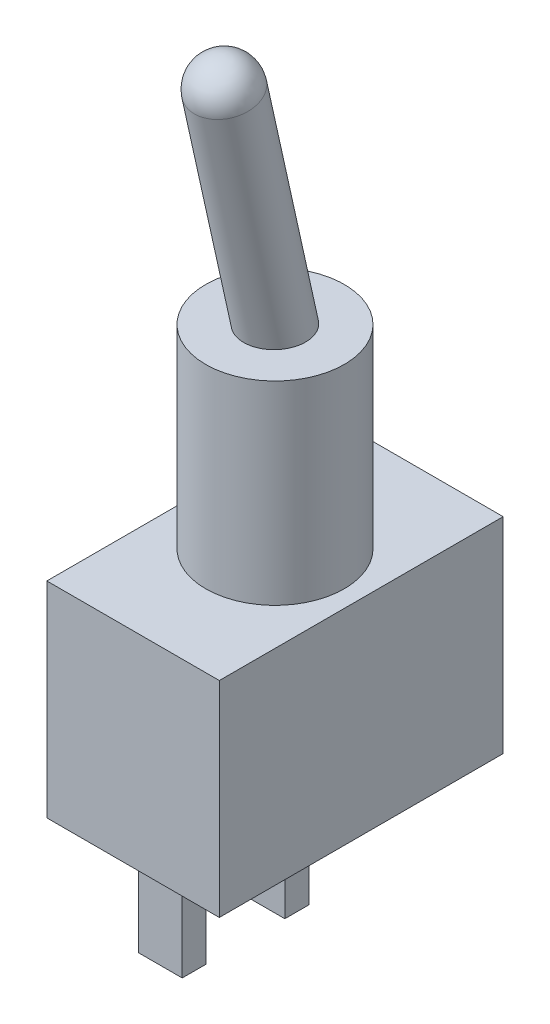
ISO-10303-21;
HEADER;
FILE_DESCRIPTION(('STEP AP214'),'2;1');
FILE_NAME('part.step','',(''),(''),'','','');
FILE_SCHEMA(('AUTOMOTIVE_DESIGN { 1 0 10303 214 1 1 1 1 }'));
ENDSEC;
DATA;
#1=APPLICATION_CONTEXT('core data for automotive mechanical design processes');
#2=APPLICATION_PROTOCOL_DEFINITION('international standard','automotive_design',2000,#1);
#3=PRODUCT_CONTEXT('',#1,'mechanical');
#4=PRODUCT('Part','Part','',(#3));
#5=PRODUCT_RELATED_PRODUCT_CATEGORY('part','',(#4));
#6=PRODUCT_DEFINITION_FORMATION('','',#4);
#7=PRODUCT_DEFINITION_CONTEXT('part definition',#1,'design');
#8=PRODUCT_DEFINITION('design','',#6,#7);
#9=PRODUCT_DEFINITION_SHAPE('','',#8);
#10=(LENGTH_UNIT() NAMED_UNIT(*) SI_UNIT(.MILLI.,.METRE.));
#11=(NAMED_UNIT(*) PLANE_ANGLE_UNIT() SI_UNIT($,.RADIAN.));
#12=(NAMED_UNIT(*) SI_UNIT($,.STERADIAN.) SOLID_ANGLE_UNIT());
#13=UNCERTAINTY_MEASURE_WITH_UNIT(LENGTH_MEASURE(1.E-05),#10,'distance_accuracy_value','');
#14=(GEOMETRIC_REPRESENTATION_CONTEXT(3) GLOBAL_UNCERTAINTY_ASSIGNED_CONTEXT((#13)) GLOBAL_UNIT_ASSIGNED_CONTEXT((#10,
#11,#12)) REPRESENTATION_CONTEXT('',''));
#15=CARTESIAN_POINT('',(0.,0.,0.));
#16=DIRECTION('',(0.,0.,1.));
#17=DIRECTION('',(1.,0.,0.));
#18=AXIS2_PLACEMENT_3D('',#15,#16,#17);
#19=CARTESIAN_POINT('',(0.,-9.4,0.));
#20=DIRECTION('',(0.,1.,0.));
#21=DIRECTION('',(0.,0.,1.));
#22=AXIS2_PLACEMENT_3D('',#19,#20,#21);
#23=PLANE('',#22);
#24=DIRECTION('',(0.,0.,1.));
#25=VECTOR('',#24,1.);
#26=CARTESIAN_POINT('',(0.999999999999999,-9.4,5.25));
#27=LINE('',#26,#25);
#28=CARTESIAN_POINT('',(0.999999999999999,-9.4,4.15));
#29=VERTEX_POINT('',#28);
#30=CARTESIAN_POINT('',(0.999999999999999,-9.4,5.25));
#31=VERTEX_POINT('',#30);
#32=EDGE_CURVE('E138',#29,#31,#27,.T.);
#33=ORIENTED_EDGE('',*,*,#32,.F.);
#34=DIRECTION('',(1.,0.,0.));
#35=VECTOR('',#34,1.);
#36=CARTESIAN_POINT('',(-1.,-9.4,4.15));
#37=LINE('',#36,#35);
#38=CARTESIAN_POINT('',(-1.,-9.4,4.15));
#39=VERTEX_POINT('',#38);
#40=EDGE_CURVE('E171',#39,#29,#37,.T.);
#41=ORIENTED_EDGE('',*,*,#40,.F.);
#42=DIRECTION('',(0.,0.,-1.));
#43=VECTOR('',#42,1.);
#44=CARTESIAN_POINT('',(-1.,-9.4,5.25));
#45=LINE('',#44,#43);
#46=CARTESIAN_POINT('',(-1.,-9.4,5.25));
#47=VERTEX_POINT('',#46);
#48=EDGE_CURVE('E183',#47,#39,#45,.T.);
#49=ORIENTED_EDGE('',*,*,#48,.F.);
#50=DIRECTION('',(-1.,0.,0.));
#51=VECTOR('',#50,1.);
#52=CARTESIAN_POINT('',(-1.,-9.4,5.25));
#53=LINE('',#52,#51);
#54=EDGE_CURVE('E180',#31,#47,#53,.T.);
#55=ORIENTED_EDGE('',*,*,#54,.F.);
#56=EDGE_LOOP('',(#33,#41,#49,#55));
#57=FACE_BOUND('',#56,.T.);
#58=DIRECTION('',(0.,0.,-1.));
#59=VECTOR('',#58,1.);
#60=CARTESIAN_POINT('',(3.95,-9.4,-6.5));
#61=LINE('',#60,#59);
#62=CARTESIAN_POINT('',(3.95,-9.4,6.5));
#63=VERTEX_POINT('',#62);
#64=CARTESIAN_POINT('',(3.95,-9.4,-6.5));
#65=VERTEX_POINT('',#64);
#66=EDGE_CURVE('E200',#63,#65,#61,.T.);
#67=ORIENTED_EDGE('',*,*,#66,.F.);
#68=DIRECTION('',(1.,0.,0.));
#69=VECTOR('',#68,1.);
#70=CARTESIAN_POINT('',(-3.95,-9.4,6.5));
#71=LINE('',#70,#69);
#72=CARTESIAN_POINT('',(-3.95,-9.4,6.5));
#73=VERTEX_POINT('',#72);
#74=EDGE_CURVE('E210',#73,#63,#71,.T.);
#75=ORIENTED_EDGE('',*,*,#74,.F.);
#76=DIRECTION('',(0.,0.,1.));
#77=VECTOR('',#76,1.);
#78=CARTESIAN_POINT('',(-3.95,-9.4,-6.5));
#79=LINE('',#78,#77);
#80=CARTESIAN_POINT('',(-3.95,-9.4,-6.5));
#81=VERTEX_POINT('',#80);
#82=EDGE_CURVE('E207',#81,#73,#79,.T.);
#83=ORIENTED_EDGE('',*,*,#82,.F.);
#84=DIRECTION('',(-1.,0.,0.));
#85=VECTOR('',#84,1.);
#86=CARTESIAN_POINT('',(-3.95,-9.4,-6.5));
#87=LINE('',#86,#85);
#88=EDGE_CURVE('E203',#65,#81,#87,.T.);
#89=ORIENTED_EDGE('',*,*,#88,.F.);
#90=EDGE_LOOP('',(#67,#75,#83,#89));
#91=FACE_BOUND('',#90,.T.);
#92=DIRECTION('',(0.,0.,1.));
#93=VECTOR('',#92,1.);
#94=CARTESIAN_POINT('',(1.,-9.4,-0.55));
#95=LINE('',#94,#93);
#96=CARTESIAN_POINT('',(1.,-9.4,-0.55));
#97=VERTEX_POINT('',#96);
#98=CARTESIAN_POINT('',(1.,-9.4,0.55));
#99=VERTEX_POINT('',#98);
#100=EDGE_CURVE('E132',#97,#99,#95,.T.);
#101=ORIENTED_EDGE('',*,*,#100,.F.);
#102=DIRECTION('',(1.,0.,0.));
#103=VECTOR('',#102,1.);
#104=CARTESIAN_POINT('',(-1.,-9.4,-0.55));
#105=LINE('',#104,#103);
#106=CARTESIAN_POINT('',(-1.,-9.4,-0.55));
#107=VERTEX_POINT('',#106);
#108=EDGE_CURVE('E134',#107,#97,#105,.T.);
#109=ORIENTED_EDGE('',*,*,#108,.F.);
#110=DIRECTION('',(0.,0.,-1.));
#111=VECTOR('',#110,1.);
#112=CARTESIAN_POINT('',(-1.,-9.4,-0.55));
#113=LINE('',#112,#111);
#114=CARTESIAN_POINT('',(-1.,-9.4,0.55));
#115=VERTEX_POINT('',#114);
#116=EDGE_CURVE('E67',#115,#107,#113,.T.);
#117=ORIENTED_EDGE('',*,*,#116,.F.);
#118=DIRECTION('',(-1.,0.,0.));
#119=VECTOR('',#118,1.);
#120=CARTESIAN_POINT('',(-1.,-9.4,0.55));
#121=LINE('',#120,#119);
#122=EDGE_CURVE('E62',#99,#115,#121,.T.);
#123=ORIENTED_EDGE('',*,*,#122,.F.);
#124=EDGE_LOOP('',(#101,#109,#117,#123));
#125=FACE_BOUND('',#124,.T.);
#126=ADVANCED_FACE('F45',(#57,#91,#125),#23,.F.);
#127=CARTESIAN_POINT('',(3.95,-9.4,-6.5));
#128=DIRECTION('',(1.,0.,0.));
#129=DIRECTION('',(0.,0.,-1.));
#130=AXIS2_PLACEMENT_3D('',#127,#128,#129);
#131=PLANE('',#130);
#132=DIRECTION('',(0.,0.,-1.));
#133=VECTOR('',#132,1.);
#134=CARTESIAN_POINT('',(3.95,0.,-6.5));
#135=LINE('',#134,#133);
#136=CARTESIAN_POINT('',(3.95,0.,6.5));
#137=VERTEX_POINT('',#136);
#138=CARTESIAN_POINT('',(3.95,0.,-6.5));
#139=VERTEX_POINT('',#138);
#140=EDGE_CURVE('E199',#137,#139,#135,.T.);
#141=ORIENTED_EDGE('',*,*,#140,.F.);
#142=DIRECTION('',(0.,1.,0.));
#143=VECTOR('',#142,1.);
#144=CARTESIAN_POINT('',(3.95,-9.4,6.5));
#145=LINE('',#144,#143);
#146=EDGE_CURVE('E54',#63,#137,#145,.T.);
#147=ORIENTED_EDGE('',*,*,#146,.F.);
#148=ORIENTED_EDGE('',*,*,#66,.T.);
#149=DIRECTION('',(0.,1.,0.));
#150=VECTOR('',#149,1.);
#151=CARTESIAN_POINT('',(3.95,-9.4,-6.5));
#152=LINE('',#151,#150);
#153=EDGE_CURVE('E213',#65,#139,#152,.T.);
#154=ORIENTED_EDGE('',*,*,#153,.T.);
#155=EDGE_LOOP('',(#141,#147,#148,#154));
#156=FACE_BOUND('',#155,.T.);
#157=ADVANCED_FACE('F47',(#156),#131,.T.);
#158=CARTESIAN_POINT('',(-3.95,-9.4,6.5));
#159=DIRECTION('',(0.,0.,1.));
#160=DIRECTION('',(1.,0.,0.));
#161=AXIS2_PLACEMENT_3D('',#158,#159,#160);
#162=PLANE('',#161);
#163=DIRECTION('',(1.,0.,0.));
#164=VECTOR('',#163,1.);
#165=CARTESIAN_POINT('',(-3.95,0.,6.5));
#166=LINE('',#165,#164);
#167=CARTESIAN_POINT('',(-3.95,0.,6.5));
#168=VERTEX_POINT('',#167);
#169=EDGE_CURVE('E204',#168,#137,#166,.T.);
#170=ORIENTED_EDGE('',*,*,#169,.F.);
#171=DIRECTION('',(0.,1.,0.));
#172=VECTOR('',#171,1.);
#173=CARTESIAN_POINT('',(-3.95,-9.4,6.5));
#174=LINE('',#173,#172);
#175=EDGE_CURVE('E225',#73,#168,#174,.T.);
#176=ORIENTED_EDGE('',*,*,#175,.F.);
#177=ORIENTED_EDGE('',*,*,#74,.T.);
#178=ORIENTED_EDGE('',*,*,#146,.T.);
#179=EDGE_LOOP('',(#170,#176,#177,#178));
#180=FACE_BOUND('',#179,.T.);
#181=ADVANCED_FACE('F240',(#180),#162,.T.);
#182=CARTESIAN_POINT('',(-3.95,-9.4,-6.5));
#183=DIRECTION('',(-1.,0.,0.));
#184=DIRECTION('',(0.,0.,1.));
#185=AXIS2_PLACEMENT_3D('',#182,#183,#184);
#186=PLANE('',#185);
#187=DIRECTION('',(0.,0.,1.));
#188=VECTOR('',#187,1.);
#189=CARTESIAN_POINT('',(-3.95,0.,-6.5));
#190=LINE('',#189,#188);
#191=CARTESIAN_POINT('',(-3.95,0.,-6.5));
#192=VERTEX_POINT('',#191);
#193=EDGE_CURVE('E219',#192,#168,#190,.T.);
#194=ORIENTED_EDGE('',*,*,#193,.F.);
#195=DIRECTION('',(0.,1.,0.));
#196=VECTOR('',#195,1.);
#197=CARTESIAN_POINT('',(-3.95,-9.4,-6.5));
#198=LINE('',#197,#196);
#199=EDGE_CURVE('E227',#81,#192,#198,.T.);
#200=ORIENTED_EDGE('',*,*,#199,.F.);
#201=ORIENTED_EDGE('',*,*,#82,.T.);
#202=ORIENTED_EDGE('',*,*,#175,.T.);
#203=EDGE_LOOP('',(#194,#200,#201,#202));
#204=FACE_BOUND('',#203,.T.);
#205=ADVANCED_FACE('F245',(#204),#186,.T.);
#206=CARTESIAN_POINT('',(-3.95,-9.4,-6.5));
#207=DIRECTION('',(0.,0.,-1.));
#208=DIRECTION('',(-1.,0.,0.));
#209=AXIS2_PLACEMENT_3D('',#206,#207,#208);
#210=PLANE('',#209);
#211=DIRECTION('',(-1.,0.,0.));
#212=VECTOR('',#211,1.);
#213=CARTESIAN_POINT('',(-3.95,0.,-6.5));
#214=LINE('',#213,#212);
#215=EDGE_CURVE('E216',#139,#192,#214,.T.);
#216=ORIENTED_EDGE('',*,*,#215,.F.);
#217=ORIENTED_EDGE('',*,*,#153,.F.);
#218=ORIENTED_EDGE('',*,*,#88,.T.);
#219=ORIENTED_EDGE('',*,*,#199,.T.);
#220=EDGE_LOOP('',(#216,#217,#218,#219));
#221=FACE_BOUND('',#220,.T.);
#222=ADVANCED_FACE('F234',(#221),#210,.T.);
#223=CARTESIAN_POINT('',(0.,0.,0.));
#224=DIRECTION('',(0.,1.,0.));
#225=DIRECTION('',(0.,0.,1.));
#226=AXIS2_PLACEMENT_3D('',#223,#224,#225);
#227=PLANE('',#226);
#228=CARTESIAN_POINT('',(0.,0.,0.));
#229=DIRECTION('',(0.,1.,0.));
#230=DIRECTION('',(0.,0.,1.));
#231=AXIS2_PLACEMENT_3D('',#228,#229,#230);
#232=CIRCLE('',#231,3.175);
#233=CARTESIAN_POINT('',(0.,0.,3.175));
#234=VERTEX_POINT('',#233);
#235=EDGE_CURVE('E11',#234,#234,#232,.T.);
#236=ORIENTED_EDGE('',*,*,#235,.F.);
#237=EDGE_LOOP('',(#236));
#238=FACE_BOUND('',#237,.T.);
#239=ORIENTED_EDGE('',*,*,#140,.T.);
#240=ORIENTED_EDGE('',*,*,#215,.T.);
#241=ORIENTED_EDGE('',*,*,#193,.T.);
#242=ORIENTED_EDGE('',*,*,#169,.T.);
#243=EDGE_LOOP('',(#239,#240,#241,#242));
#244=FACE_BOUND('',#243,.T.);
#245=ADVANCED_FACE('F237',(#238,#244),#227,.T.);
#246=CARTESIAN_POINT('',(0.999999999999999,-13.9,5.25));
#247=DIRECTION('',(-1.,0.,0.));
#248=DIRECTION('',(0.,0.,1.));
#249=AXIS2_PLACEMENT_3D('',#246,#247,#248);
#250=PLANE('',#249);
#251=ORIENTED_EDGE('',*,*,#32,.T.);
#252=DIRECTION('',(0.,1.,0.));
#253=VECTOR('',#252,1.);
#254=CARTESIAN_POINT('',(0.999999999999999,-13.9,5.25));
#255=LINE('',#254,#253);
#256=CARTESIAN_POINT('',(0.999999999999999,-13.9,5.25));
#257=VERTEX_POINT('',#256);
#258=EDGE_CURVE('E196',#257,#31,#255,.T.);
#259=ORIENTED_EDGE('',*,*,#258,.F.);
#260=DIRECTION('',(0.,0.,1.));
#261=VECTOR('',#260,1.);
#262=CARTESIAN_POINT('',(0.999999999999999,-13.9,5.25));
#263=LINE('',#262,#261);
#264=CARTESIAN_POINT('',(0.999999999999999,-13.9,4.15));
#265=VERTEX_POINT('',#264);
#266=EDGE_CURVE('E167',#265,#257,#263,.T.);
#267=ORIENTED_EDGE('',*,*,#266,.F.);
#268=DIRECTION('',(0.,1.,0.));
#269=VECTOR('',#268,1.);
#270=CARTESIAN_POINT('',(0.999999999999999,-13.9,4.15));
#271=LINE('',#270,#269);
#272=EDGE_CURVE('E177',#265,#29,#271,.T.);
#273=ORIENTED_EDGE('',*,*,#272,.T.);
#274=EDGE_LOOP('',(#251,#259,#267,#273));
#275=FACE_BOUND('',#274,.T.);
#276=ADVANCED_FACE('F261',(#275),#250,.F.);
#277=CARTESIAN_POINT('',(-1.,-13.9,5.25));
#278=DIRECTION('',(0.,0.,-1.));
#279=DIRECTION('',(-1.,0.,0.));
#280=AXIS2_PLACEMENT_3D('',#277,#278,#279);
#281=PLANE('',#280);
#282=ORIENTED_EDGE('',*,*,#54,.T.);
#283=DIRECTION('',(0.,1.,0.));
#284=VECTOR('',#283,1.);
#285=CARTESIAN_POINT('',(-1.,-13.9,5.25));
#286=LINE('',#285,#284);
#287=CARTESIAN_POINT('',(-1.,-13.9,5.25));
#288=VERTEX_POINT('',#287);
#289=EDGE_CURVE('E193',#288,#47,#286,.T.);
#290=ORIENTED_EDGE('',*,*,#289,.F.);
#291=DIRECTION('',(-1.,0.,0.));
#292=VECTOR('',#291,1.);
#293=CARTESIAN_POINT('',(-1.,-13.9,5.25));
#294=LINE('',#293,#292);
#295=EDGE_CURVE('E170',#257,#288,#294,.T.);
#296=ORIENTED_EDGE('',*,*,#295,.F.);
#297=ORIENTED_EDGE('',*,*,#258,.T.);
#298=EDGE_LOOP('',(#282,#290,#296,#297));
#299=FACE_BOUND('',#298,.T.);
#300=ADVANCED_FACE('F268',(#299),#281,.F.);
#301=CARTESIAN_POINT('',(-1.,-13.9,5.25));
#302=DIRECTION('',(1.,0.,0.));
#303=DIRECTION('',(0.,0.,-1.));
#304=AXIS2_PLACEMENT_3D('',#301,#302,#303);
#305=PLANE('',#304);
#306=ORIENTED_EDGE('',*,*,#48,.T.);
#307=DIRECTION('',(0.,1.,0.));
#308=VECTOR('',#307,1.);
#309=CARTESIAN_POINT('',(-1.,-13.9,4.15));
#310=LINE('',#309,#308);
#311=CARTESIAN_POINT('',(-1.,-13.9,4.15));
#312=VERTEX_POINT('',#311);
#313=EDGE_CURVE('E190',#312,#39,#310,.T.);
#314=ORIENTED_EDGE('',*,*,#313,.F.);
#315=DIRECTION('',(0.,0.,-1.));
#316=VECTOR('',#315,1.);
#317=CARTESIAN_POINT('',(-1.,-13.9,5.25));
#318=LINE('',#317,#316);
#319=EDGE_CURVE('E173',#288,#312,#318,.T.);
#320=ORIENTED_EDGE('',*,*,#319,.F.);
#321=ORIENTED_EDGE('',*,*,#289,.T.);
#322=EDGE_LOOP('',(#306,#314,#320,#321));
#323=FACE_BOUND('',#322,.T.);
#324=ADVANCED_FACE('F309',(#323),#305,.F.);
#325=CARTESIAN_POINT('',(-1.,-13.9,4.15));
#326=DIRECTION('',(0.,0.,1.));
#327=DIRECTION('',(1.,0.,0.));
#328=AXIS2_PLACEMENT_3D('',#325,#326,#327);
#329=PLANE('',#328);
#330=ORIENTED_EDGE('',*,*,#40,.T.);
#331=ORIENTED_EDGE('',*,*,#272,.F.);
#332=DIRECTION('',(1.,0.,0.));
#333=VECTOR('',#332,1.);
#334=CARTESIAN_POINT('',(-1.,-13.9,4.15));
#335=LINE('',#334,#333);
#336=EDGE_CURVE('E175',#312,#265,#335,.T.);
#337=ORIENTED_EDGE('',*,*,#336,.F.);
#338=ORIENTED_EDGE('',*,*,#313,.T.);
#339=EDGE_LOOP('',(#330,#331,#337,#338));
#340=FACE_BOUND('',#339,.T.);
#341=ADVANCED_FACE('F305',(#340),#329,.F.);
#342=CARTESIAN_POINT('',(0.,-13.9,0.));
#343=DIRECTION('',(0.,-1.,0.));
#344=DIRECTION('',(0.,0.,-1.));
#345=AXIS2_PLACEMENT_3D('',#342,#343,#344);
#346=PLANE('',#345);
#347=ORIENTED_EDGE('',*,*,#266,.T.);
#348=ORIENTED_EDGE('',*,*,#295,.T.);
#349=ORIENTED_EDGE('',*,*,#319,.T.);
#350=ORIENTED_EDGE('',*,*,#336,.T.);
#351=EDGE_LOOP('',(#347,#348,#349,#350));
#352=FACE_BOUND('',#351,.T.);
#353=ADVANCED_FACE('F293',(#352),#346,.T.);
#354=CARTESIAN_POINT('',(1.,-13.9,-0.55));
#355=DIRECTION('',(-1.,0.,0.));
#356=DIRECTION('',(0.,0.,1.));
#357=AXIS2_PLACEMENT_3D('',#354,#355,#356);
#358=PLANE('',#357);
#359=ORIENTED_EDGE('',*,*,#100,.T.);
#360=DIRECTION('',(0.,1.,0.));
#361=VECTOR('',#360,1.);
#362=CARTESIAN_POINT('',(1.,-13.9,0.55));
#363=LINE('',#362,#361);
#364=CARTESIAN_POINT('',(1.,-13.9,0.55));
#365=VERTEX_POINT('',#364);
#366=EDGE_CURVE('E531',#365,#99,#363,.T.);
#367=ORIENTED_EDGE('',*,*,#366,.F.);
#368=DIRECTION('',(0.,0.,1.));
#369=VECTOR('',#368,1.);
#370=CARTESIAN_POINT('',(1.,-13.9,-0.55));
#371=LINE('',#370,#369);
#372=CARTESIAN_POINT('',(1.,-13.9,-0.55));
#373=VERTEX_POINT('',#372);
#374=EDGE_CURVE('E149',#373,#365,#371,.T.);
#375=ORIENTED_EDGE('',*,*,#374,.F.);
#376=DIRECTION('',(0.,1.,0.));
#377=VECTOR('',#376,1.);
#378=CARTESIAN_POINT('',(1.,-13.9,-0.55));
#379=LINE('',#378,#377);
#380=EDGE_CURVE('E145',#373,#97,#379,.T.);
#381=ORIENTED_EDGE('',*,*,#380,.T.);
#382=EDGE_LOOP('',(#359,#367,#375,#381));
#383=FACE_BOUND('',#382,.T.);
#384=ADVANCED_FACE('F151',(#383),#358,.F.);
#385=CARTESIAN_POINT('',(-1.,-13.9,0.55));
#386=DIRECTION('',(0.,0.,-1.));
#387=DIRECTION('',(-1.,0.,0.));
#388=AXIS2_PLACEMENT_3D('',#385,#386,#387);
#389=PLANE('',#388);
#390=ORIENTED_EDGE('',*,*,#122,.T.);
#391=DIRECTION('',(0.,1.,0.));
#392=VECTOR('',#391,1.);
#393=CARTESIAN_POINT('',(-1.,-13.9,0.55));
#394=LINE('',#393,#392);
#395=CARTESIAN_POINT('',(-1.,-13.9,0.55));
#396=VERTEX_POINT('',#395);
#397=EDGE_CURVE('E157',#396,#115,#394,.T.);
#398=ORIENTED_EDGE('',*,*,#397,.F.);
#399=DIRECTION('',(-1.,0.,0.));
#400=VECTOR('',#399,1.);
#401=CARTESIAN_POINT('',(-1.,-13.9,0.55));
#402=LINE('',#401,#400);
#403=EDGE_CURVE('E164',#365,#396,#402,.T.);
#404=ORIENTED_EDGE('',*,*,#403,.F.);
#405=ORIENTED_EDGE('',*,*,#366,.T.);
#406=EDGE_LOOP('',(#390,#398,#404,#405));
#407=FACE_BOUND('',#406,.T.);
#408=ADVANCED_FACE('F292',(#407),#389,.F.);
#409=CARTESIAN_POINT('',(-1.,-13.9,-0.55));
#410=DIRECTION('',(1.,0.,0.));
#411=DIRECTION('',(0.,0.,-1.));
#412=AXIS2_PLACEMENT_3D('',#409,#410,#411);
#413=PLANE('',#412);
#414=ORIENTED_EDGE('',*,*,#116,.T.);
#415=DIRECTION('',(0.,1.,0.));
#416=VECTOR('',#415,1.);
#417=CARTESIAN_POINT('',(-1.,-13.9,-0.55));
#418=LINE('',#417,#416);
#419=CARTESIAN_POINT('',(-1.,-13.9,-0.55));
#420=VERTEX_POINT('',#419);
#421=EDGE_CURVE('E148',#420,#107,#418,.T.);
#422=ORIENTED_EDGE('',*,*,#421,.F.);
#423=DIRECTION('',(0.,0.,-1.));
#424=VECTOR('',#423,1.);
#425=CARTESIAN_POINT('',(-1.,-13.9,-0.55));
#426=LINE('',#425,#424);
#427=EDGE_CURVE('E155',#396,#420,#426,.T.);
#428=ORIENTED_EDGE('',*,*,#427,.F.);
#429=ORIENTED_EDGE('',*,*,#397,.T.);
#430=EDGE_LOOP('',(#414,#422,#428,#429));
#431=FACE_BOUND('',#430,.T.);
#432=ADVANCED_FACE('F296',(#431),#413,.F.);
#433=CARTESIAN_POINT('',(-1.,-13.9,-0.55));
#434=DIRECTION('',(0.,0.,1.));
#435=DIRECTION('',(1.,0.,0.));
#436=AXIS2_PLACEMENT_3D('',#433,#434,#435);
#437=PLANE('',#436);
#438=ORIENTED_EDGE('',*,*,#108,.T.);
#439=ORIENTED_EDGE('',*,*,#380,.F.);
#440=DIRECTION('',(1.,0.,0.));
#441=VECTOR('',#440,1.);
#442=CARTESIAN_POINT('',(-1.,-13.9,-0.55));
#443=LINE('',#442,#441);
#444=EDGE_CURVE('E153',#420,#373,#443,.T.);
#445=ORIENTED_EDGE('',*,*,#444,.F.);
#446=ORIENTED_EDGE('',*,*,#421,.T.);
#447=EDGE_LOOP('',(#438,#439,#445,#446));
#448=FACE_BOUND('',#447,.T.);
#449=ADVANCED_FACE('F143',(#448),#437,.F.);
#450=CARTESIAN_POINT('',(0.,-13.9,0.));
#451=DIRECTION('',(0.,1.,0.));
#452=DIRECTION('',(0.,0.,1.));
#453=AXIS2_PLACEMENT_3D('',#450,#451,#452);
#454=PLANE('',#453);
#455=ORIENTED_EDGE('',*,*,#374,.T.);
#456=ORIENTED_EDGE('',*,*,#403,.T.);
#457=ORIENTED_EDGE('',*,*,#427,.T.);
#458=ORIENTED_EDGE('',*,*,#444,.T.);
#459=EDGE_LOOP('',(#455,#456,#457,#458));
#460=FACE_BOUND('',#459,.T.);
#461=ADVANCED_FACE('F275',(#460),#454,.F.);
#462=CARTESIAN_POINT('',(0.,8.9,0.));
#463=DIRECTION('',(0.,-1.,0.));
#464=DIRECTION('',(0.,0.,-1.));
#465=AXIS2_PLACEMENT_3D('',#462,#463,#464);
#466=CYLINDRICAL_SURFACE('',#465,3.175);
#467=CARTESIAN_POINT('',(0.,8.9,0.));
#468=DIRECTION('',(0.,1.,0.));
#469=DIRECTION('',(0.,0.,1.));
#470=AXIS2_PLACEMENT_3D('',#467,#468,#469);
#471=CIRCLE('',#470,3.175);
#472=CARTESIAN_POINT('',(0.,8.9,3.175));
#473=VERTEX_POINT('',#472);
#474=EDGE_CURVE('E528',#473,#473,#471,.T.);
#475=ORIENTED_EDGE('',*,*,#474,.F.);
#476=EDGE_LOOP('',(#475));
#477=FACE_BOUND('',#476,.T.);
#478=ORIENTED_EDGE('',*,*,#235,.T.);
#479=EDGE_LOOP('',(#478));
#480=FACE_BOUND('',#479,.T.);
#481=ADVANCED_FACE('F272',(#477,#480),#466,.T.);
#482=CARTESIAN_POINT('',(0.,8.9,0.));
#483=DIRECTION('',(0.,1.,0.));
#484=DIRECTION('',(0.,0.,1.));
#485=AXIS2_PLACEMENT_3D('',#482,#483,#484);
#486=PLANE('',#485);
#487=CARTESIAN_POINT('',(0.,8.9,0.));
#488=DIRECTION('',(0.,1.,0.));
#489=DIRECTION('',(0.,0.,1.));
#490=AXIS2_PLACEMENT_3D('',#487,#488,#489);
#491=ELLIPSE('',#490,1.43399132004031,1.4);
#492=CARTESIAN_POINT('',(0.,8.9,1.43399132004031));
#493=VERTEX_POINT('',#492);
#494=EDGE_CURVE('E49',#493,#493,#491,.F.);
#495=ORIENTED_EDGE('',*,*,#494,.T.);
#496=EDGE_LOOP('',(#495));
#497=FACE_BOUND('',#496,.T.);
#498=ORIENTED_EDGE('',*,*,#474,.T.);
#499=EDGE_LOOP('',(#498));
#500=FACE_BOUND('',#499,.T.);
#501=ADVANCED_FACE('F274',(#497,#500),#486,.T.);
#502=CARTESIAN_POINT('',(0.,20.7668144099679,2.63080941726422));
#503=DIRECTION('',(0.,0.976296007119933,0.216439613938104));
#504=DIRECTION('',(0.,-0.216439613938104,0.976296007119933));
#505=AXIS2_PLACEMENT_3D('',#502,#503,#504);
#506=CYLINDRICAL_SURFACE('',#505,1.4);
#507=ORIENTED_EDGE('',*,*,#494,.F.);
#508=EDGE_LOOP('',(#507));
#509=FACE_BOUND('',#508,.T.);
#510=CARTESIAN_POINT('',(0.,19.4,2.32779395775088));
#511=DIRECTION('',(0.,0.976296007119933,0.216439613938104));
#512=DIRECTION('',(0.,-0.216439613938104,0.976296007119933));
#513=AXIS2_PLACEMENT_3D('',#510,#511,#512);
#514=CIRCLE('',#513,1.4);
#515=CARTESIAN_POINT('',(0.,19.0969845404867,3.69460836771878));
#516=VERTEX_POINT('',#515);
#517=EDGE_CURVE('E524',#516,#516,#514,.T.);
#518=ORIENTED_EDGE('',*,*,#517,.F.);
#519=EDGE_LOOP('',(#518));
#520=FACE_BOUND('',#519,.T.);
#521=ADVANCED_FACE('F282',(#509,#520),#506,.T.);
#522=CARTESIAN_POINT('',(0.,19.4,2.32779395775088));
#523=DIRECTION('',(0.,0.976296007119933,0.216439613938104));
#524=DIRECTION('',(0.,0.216439613938104,-0.976296007119933));
#525=AXIS2_PLACEMENT_3D('',#522,#523,#524);
#526=SPHERICAL_SURFACE('',#525,1.4);
#527=ORIENTED_EDGE('',*,*,#517,.T.);
#528=EDGE_LOOP('',(#527));
#529=FACE_BOUND('',#528,.T.);
#530=ADVANCED_FACE('F378',(#529),#526,.T.);
#531=CLOSED_SHELL('',(#126,#157,#181,#205,#222,#245,#276,#300,#324,#341,#353,#384,#408,#432,
#449,#461,#481,#501,#521,#530));
#532=MANIFOLD_SOLID_BREP('B2',#531);
#533=ADVANCED_BREP_SHAPE_REPRESENTATION('',(#18,#532),#14);
#534=SHAPE_DEFINITION_REPRESENTATION(#9,#533);
ENDSEC;
END-ISO-10303-21;
